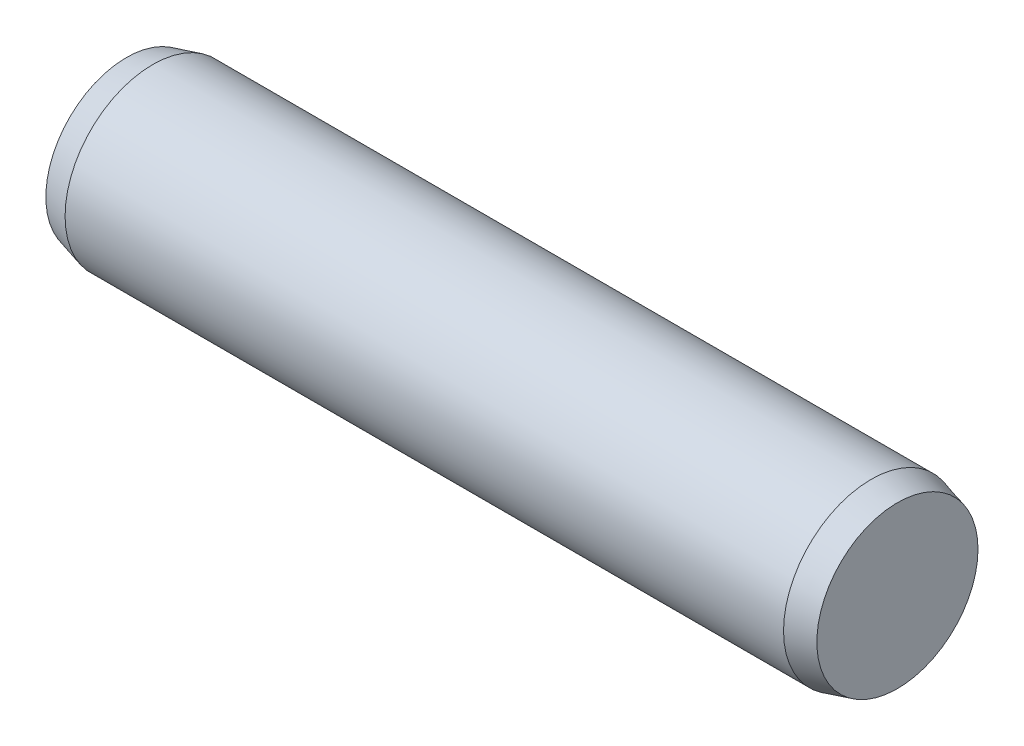
ISO-10303-21;
HEADER;
FILE_DESCRIPTION(('STEP AP214'),'2;1');
FILE_NAME('part.step','',(''),(''),'','','');
FILE_SCHEMA(('AUTOMOTIVE_DESIGN { 1 0 10303 214 1 1 1 1 }'));
ENDSEC;
DATA;
#1=APPLICATION_CONTEXT('core data for automotive mechanical design processes');
#2=APPLICATION_PROTOCOL_DEFINITION('international standard','automotive_design',2000,#1);
#3=PRODUCT_CONTEXT('',#1,'mechanical');
#4=PRODUCT('Part','Part','',(#3));
#5=PRODUCT_RELATED_PRODUCT_CATEGORY('part','',(#4));
#6=PRODUCT_DEFINITION_FORMATION('','',#4);
#7=PRODUCT_DEFINITION_CONTEXT('part definition',#1,'design');
#8=PRODUCT_DEFINITION('design','',#6,#7);
#9=PRODUCT_DEFINITION_SHAPE('','',#8);
#10=(LENGTH_UNIT() NAMED_UNIT(*) SI_UNIT(.MILLI.,.METRE.));
#11=(NAMED_UNIT(*) PLANE_ANGLE_UNIT() SI_UNIT($,.RADIAN.));
#12=(NAMED_UNIT(*) SI_UNIT($,.STERADIAN.) SOLID_ANGLE_UNIT());
#13=UNCERTAINTY_MEASURE_WITH_UNIT(LENGTH_MEASURE(1.E-05),#10,'distance_accuracy_value','');
#14=(GEOMETRIC_REPRESENTATION_CONTEXT(3) GLOBAL_UNCERTAINTY_ASSIGNED_CONTEXT((#13)) GLOBAL_UNIT_ASSIGNED_CONTEXT((#10,
#11,#12)) REPRESENTATION_CONTEXT('',''));
#15=CARTESIAN_POINT('',(0.,0.,0.));
#16=DIRECTION('',(0.,0.,1.));
#17=DIRECTION('',(1.,0.,0.));
#18=AXIS2_PLACEMENT_3D('',#15,#16,#17);
#19=CARTESIAN_POINT('',(11.,0.,0.));
#20=DIRECTION('',(-1.,0.,0.));
#21=DIRECTION('',(0.,0.,1.));
#22=AXIS2_PLACEMENT_3D('',#19,#20,#21);
#23=CYLINDRICAL_SURFACE('',#22,2.5);
#24=CARTESIAN_POINT('',(10.25,0.,0.));
#25=DIRECTION('',(1.,0.,0.));
#26=DIRECTION('',(0.,0.,-1.));
#27=AXIS2_PLACEMENT_3D('',#24,#25,#26);
#28=CIRCLE('',#27,2.5);
#29=CARTESIAN_POINT('',(10.25,0.,-2.5));
#30=VERTEX_POINT('',#29);
#31=EDGE_CURVE('E38',#30,#30,#28,.F.);
#32=ORIENTED_EDGE('',*,*,#31,.T.);
#33=EDGE_LOOP('',(#32));
#34=FACE_BOUND('',#33,.T.);
#35=CARTESIAN_POINT('',(-10.25,0.,0.));
#36=DIRECTION('',(1.,0.,0.));
#37=DIRECTION('',(0.,0.,-1.));
#38=AXIS2_PLACEMENT_3D('',#35,#36,#37);
#39=CIRCLE('',#38,2.5);
#40=CARTESIAN_POINT('',(-10.25,0.,-2.5));
#41=VERTEX_POINT('',#40);
#42=EDGE_CURVE('E42',#41,#41,#39,.T.);
#43=ORIENTED_EDGE('',*,*,#42,.T.);
#44=EDGE_LOOP('',(#43));
#45=FACE_BOUND('',#44,.T.);
#46=ADVANCED_FACE('F31',(#34,#45),#23,.T.);
#47=CARTESIAN_POINT('',(11.,0.,0.));
#48=DIRECTION('',(1.,0.,0.));
#49=DIRECTION('',(0.,0.,-1.));
#50=AXIS2_PLACEMENT_3D('',#47,#48,#49);
#51=PLANE('',#50);
#52=CARTESIAN_POINT('',(11.,0.,0.));
#53=DIRECTION('',(1.,0.,0.));
#54=DIRECTION('',(0.,0.,-1.));
#55=AXIS2_PLACEMENT_3D('',#52,#53,#54);
#56=CIRCLE('',#55,2.29903810567666);
#57=CARTESIAN_POINT('',(11.,0.,-2.29903810567666));
#58=VERTEX_POINT('',#57);
#59=EDGE_CURVE('E46',#58,#58,#56,.T.);
#60=ORIENTED_EDGE('',*,*,#59,.T.);
#61=EDGE_LOOP('',(#60));
#62=FACE_BOUND('',#61,.T.);
#63=ADVANCED_FACE('F52',(#62),#51,.T.);
#64=CARTESIAN_POINT('',(-11.,0.,0.));
#65=DIRECTION('',(1.,0.,0.));
#66=DIRECTION('',(0.,0.,-1.));
#67=AXIS2_PLACEMENT_3D('',#64,#65,#66);
#68=PLANE('',#67);
#69=CARTESIAN_POINT('',(-11.,0.,0.));
#70=DIRECTION('',(1.,0.,0.));
#71=DIRECTION('',(0.,0.,-1.));
#72=AXIS2_PLACEMENT_3D('',#69,#70,#71);
#73=CIRCLE('',#72,2.29903810567666);
#74=CARTESIAN_POINT('',(-11.,0.,-2.29903810567666));
#75=VERTEX_POINT('',#74);
#76=EDGE_CURVE('E10',#75,#75,#73,.F.);
#77=ORIENTED_EDGE('',*,*,#76,.T.);
#78=EDGE_LOOP('',(#77));
#79=FACE_BOUND('',#78,.T.);
#80=ADVANCED_FACE('F56',(#79),#68,.F.);
#81=CARTESIAN_POINT('',(11.,0.,0.));
#82=DIRECTION('',(-1.,0.,0.));
#83=DIRECTION('',(0.,0.,1.));
#84=AXIS2_PLACEMENT_3D('',#81,#82,#83);
#85=CONICAL_SURFACE('',#84,2.29903810567666,0.261799387799146);
#86=ORIENTED_EDGE('',*,*,#31,.F.);
#87=EDGE_LOOP('',(#86));
#88=FACE_BOUND('',#87,.T.);
#89=ORIENTED_EDGE('',*,*,#59,.F.);
#90=EDGE_LOOP('',(#89));
#91=FACE_BOUND('',#90,.T.);
#92=ADVANCED_FACE('F54',(#88,#91),#85,.T.);
#93=CARTESIAN_POINT('',(-10.25,0.,0.));
#94=DIRECTION('',(1.,0.,0.));
#95=DIRECTION('',(0.,0.,-1.));
#96=AXIS2_PLACEMENT_3D('',#93,#94,#95);
#97=CONICAL_SURFACE('',#96,2.5,0.261799387799145);
#98=ORIENTED_EDGE('',*,*,#76,.F.);
#99=EDGE_LOOP('',(#98));
#100=FACE_BOUND('',#99,.T.);
#101=ORIENTED_EDGE('',*,*,#42,.F.);
#102=EDGE_LOOP('',(#101));
#103=FACE_BOUND('',#102,.T.);
#104=ADVANCED_FACE('F33',(#100,#103),#97,.T.);
#105=CLOSED_SHELL('',(#46,#63,#80,#92,#104));
#106=MANIFOLD_SOLID_BREP('B2',#105);
#107=ADVANCED_BREP_SHAPE_REPRESENTATION('',(#18,#106),#14);
#108=SHAPE_DEFINITION_REPRESENTATION(#9,#107);
ENDSEC;
END-ISO-10303-21;
